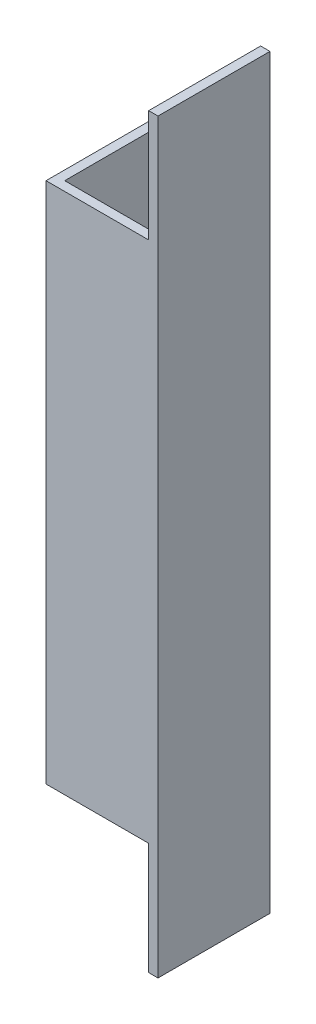
ISO-10303-21;
HEADER;
FILE_DESCRIPTION(('STEP AP214'),'2;1');
FILE_NAME('part.step','',(''),(''),'','','');
FILE_SCHEMA(('AUTOMOTIVE_DESIGN { 1 0 10303 214 1 1 1 1 }'));
ENDSEC;
DATA;
#1=APPLICATION_CONTEXT('core data for automotive mechanical design processes');
#2=APPLICATION_PROTOCOL_DEFINITION('international standard','automotive_design',2000,#1);
#3=PRODUCT_CONTEXT('',#1,'mechanical');
#4=PRODUCT('Part','Part','',(#3));
#5=PRODUCT_RELATED_PRODUCT_CATEGORY('part','',(#4));
#6=PRODUCT_DEFINITION_FORMATION('','',#4);
#7=PRODUCT_DEFINITION_CONTEXT('part definition',#1,'design');
#8=PRODUCT_DEFINITION('design','',#6,#7);
#9=PRODUCT_DEFINITION_SHAPE('','',#8);
#10=(LENGTH_UNIT() NAMED_UNIT(*) SI_UNIT(.MILLI.,.METRE.));
#11=(NAMED_UNIT(*) PLANE_ANGLE_UNIT() SI_UNIT($,.RADIAN.));
#12=(NAMED_UNIT(*) SI_UNIT($,.STERADIAN.) SOLID_ANGLE_UNIT());
#13=UNCERTAINTY_MEASURE_WITH_UNIT(LENGTH_MEASURE(1.E-05),#10,'distance_accuracy_value','');
#14=(GEOMETRIC_REPRESENTATION_CONTEXT(3) GLOBAL_UNCERTAINTY_ASSIGNED_CONTEXT((#13)) GLOBAL_UNIT_ASSIGNED_CONTEXT((#10,
#11,#12)) REPRESENTATION_CONTEXT('',''));
#15=CARTESIAN_POINT('',(0.,0.,0.));
#16=DIRECTION('',(0.,0.,1.));
#17=DIRECTION('',(1.,0.,0.));
#18=AXIS2_PLACEMENT_3D('',#15,#16,#17);
#19=CARTESIAN_POINT('',(0.,0.,0.));
#20=DIRECTION('',(0.,1.,0.));
#21=DIRECTION('',(0.,0.,1.));
#22=AXIS2_PLACEMENT_3D('',#19,#20,#21);
#23=PLANE('',#22);
#24=DIRECTION('',(0.,0.,-1.));
#25=VECTOR('',#24,1.);
#26=CARTESIAN_POINT('',(17.4625,0.,0.));
#27=LINE('',#26,#25);
#28=CARTESIAN_POINT('',(17.4625,0.,0.));
#29=VERTEX_POINT('',#28);
#30=CARTESIAN_POINT('',(17.4625,0.,-19.05));
#31=VERTEX_POINT('',#30);
#32=EDGE_CURVE('E118',#29,#31,#27,.T.);
#33=ORIENTED_EDGE('',*,*,#32,.T.);
#34=DIRECTION('',(-1.,0.,0.));
#35=VECTOR('',#34,1.);
#36=CARTESIAN_POINT('',(0.,0.,-19.05));
#37=LINE('',#36,#35);
#38=CARTESIAN_POINT('',(19.05,0.,-19.05));
#39=VERTEX_POINT('',#38);
#40=EDGE_CURVE('E103',#39,#31,#37,.T.);
#41=ORIENTED_EDGE('',*,*,#40,.F.);
#42=DIRECTION('',(0.,0.,-1.));
#43=VECTOR('',#42,1.);
#44=CARTESIAN_POINT('',(19.05,0.,0.));
#45=LINE('',#44,#43);
#46=CARTESIAN_POINT('',(19.05,0.,0.));
#47=VERTEX_POINT('',#46);
#48=EDGE_CURVE('E93',#47,#39,#45,.T.);
#49=ORIENTED_EDGE('',*,*,#48,.F.);
#50=DIRECTION('',(1.,0.,0.));
#51=VECTOR('',#50,1.);
#52=CARTESIAN_POINT('',(0.,0.,0.));
#53=LINE('',#52,#51);
#54=EDGE_CURVE('E104',#29,#47,#53,.T.);
#55=ORIENTED_EDGE('',*,*,#54,.F.);
#56=EDGE_LOOP('',(#33,#41,#49,#55));
#57=FACE_BOUND('',#56,.T.);
#58=ADVANCED_FACE('F57',(#57),#23,.F.);
#59=CARTESIAN_POINT('',(0.,127.,0.));
#60=DIRECTION('',(0.,1.,0.));
#61=DIRECTION('',(0.,0.,1.));
#62=AXIS2_PLACEMENT_3D('',#59,#60,#61);
#63=PLANE('',#62);
#64=DIRECTION('',(0.,0.,-1.));
#65=VECTOR('',#64,1.);
#66=CARTESIAN_POINT('',(17.4625,127.,0.));
#67=LINE('',#66,#65);
#68=CARTESIAN_POINT('',(17.4625,127.,0.));
#69=VERTEX_POINT('',#68);
#70=CARTESIAN_POINT('',(17.4625,127.,-19.05));
#71=VERTEX_POINT('',#70);
#72=EDGE_CURVE('E167',#69,#71,#67,.T.);
#73=ORIENTED_EDGE('',*,*,#72,.F.);
#74=DIRECTION('',(1.,0.,0.));
#75=VECTOR('',#74,1.);
#76=CARTESIAN_POINT('',(0.,127.,0.));
#77=LINE('',#76,#75);
#78=CARTESIAN_POINT('',(19.05,127.,0.));
#79=VERTEX_POINT('',#78);
#80=EDGE_CURVE('E120',#69,#79,#77,.T.);
#81=ORIENTED_EDGE('',*,*,#80,.T.);
#82=DIRECTION('',(0.,0.,-1.));
#83=VECTOR('',#82,1.);
#84=CARTESIAN_POINT('',(19.05,127.,0.));
#85=LINE('',#84,#83);
#86=CARTESIAN_POINT('',(19.05,127.,-19.05));
#87=VERTEX_POINT('',#86);
#88=EDGE_CURVE('E80',#79,#87,#85,.T.);
#89=ORIENTED_EDGE('',*,*,#88,.T.);
#90=DIRECTION('',(-1.,0.,0.));
#91=VECTOR('',#90,1.);
#92=CARTESIAN_POINT('',(0.,127.,-19.05));
#93=LINE('',#92,#91);
#94=EDGE_CURVE('E113',#87,#71,#93,.T.);
#95=ORIENTED_EDGE('',*,*,#94,.T.);
#96=EDGE_LOOP('',(#73,#81,#89,#95));
#97=FACE_BOUND('',#96,.T.);
#98=ADVANCED_FACE('F257',(#97),#63,.T.);
#99=CARTESIAN_POINT('',(0.,127.,0.));
#100=DIRECTION('',(1.,0.,0.));
#101=DIRECTION('',(0.,0.,-1.));
#102=AXIS2_PLACEMENT_3D('',#99,#100,#101);
#103=PLANE('',#102);
#104=DIRECTION('',(0.,-1.,0.));
#105=VECTOR('',#104,1.);
#106=CARTESIAN_POINT('',(0.,127.,0.));
#107=LINE('',#106,#105);
#108=CARTESIAN_POINT('',(0.,107.95,0.));
#109=VERTEX_POINT('',#108);
#110=CARTESIAN_POINT('',(0.,19.05,0.));
#111=VERTEX_POINT('',#110);
#112=EDGE_CURVE('E128',#109,#111,#107,.T.);
#113=ORIENTED_EDGE('',*,*,#112,.F.);
#114=DIRECTION('',(0.,0.,1.));
#115=VECTOR('',#114,1.);
#116=CARTESIAN_POINT('',(0.,107.95,0.));
#117=LINE('',#116,#115);
#118=CARTESIAN_POINT('',(0.,107.95,-19.05));
#119=VERTEX_POINT('',#118);
#120=EDGE_CURVE('E262',#119,#109,#117,.T.);
#121=ORIENTED_EDGE('',*,*,#120,.F.);
#122=DIRECTION('',(0.,-1.,0.));
#123=VECTOR('',#122,1.);
#124=CARTESIAN_POINT('',(0.,127.,-19.05));
#125=LINE('',#124,#123);
#126=CARTESIAN_POINT('',(0.,19.05,-19.05));
#127=VERTEX_POINT('',#126);
#128=EDGE_CURVE('E114',#119,#127,#125,.T.);
#129=ORIENTED_EDGE('',*,*,#128,.T.);
#130=DIRECTION('',(0.,0.,-1.));
#131=VECTOR('',#130,1.);
#132=CARTESIAN_POINT('',(0.,19.05,0.));
#133=LINE('',#132,#131);
#134=EDGE_CURVE('E220',#111,#127,#133,.T.);
#135=ORIENTED_EDGE('',*,*,#134,.F.);
#136=EDGE_LOOP('',(#113,#121,#129,#135));
#137=FACE_BOUND('',#136,.T.);
#138=ADVANCED_FACE('F59',(#137),#103,.F.);
#139=CARTESIAN_POINT('',(0.,127.,0.));
#140=DIRECTION('',(0.,0.,-1.));
#141=DIRECTION('',(-1.,0.,0.));
#142=AXIS2_PLACEMENT_3D('',#139,#140,#141);
#143=PLANE('',#142);
#144=DIRECTION('',(0.,1.,0.));
#145=VECTOR('',#144,1.);
#146=CARTESIAN_POINT('',(17.4625,127.,0.));
#147=LINE('',#146,#145);
#148=CARTESIAN_POINT('',(17.4625,107.95,0.));
#149=VERTEX_POINT('',#148);
#150=EDGE_CURVE('E258',#149,#69,#147,.T.);
#151=ORIENTED_EDGE('',*,*,#150,.F.);
#152=DIRECTION('',(-1.,0.,0.));
#153=VECTOR('',#152,1.);
#154=CARTESIAN_POINT('',(17.4625,107.95,0.));
#155=LINE('',#154,#153);
#156=EDGE_CURVE('E218',#149,#109,#155,.T.);
#157=ORIENTED_EDGE('',*,*,#156,.T.);
#158=ORIENTED_EDGE('',*,*,#112,.T.);
#159=DIRECTION('',(-1.,0.,0.));
#160=VECTOR('',#159,1.);
#161=CARTESIAN_POINT('',(17.4625,19.05,0.));
#162=LINE('',#161,#160);
#163=CARTESIAN_POINT('',(17.4625,19.05,0.));
#164=VERTEX_POINT('',#163);
#165=EDGE_CURVE('E163',#164,#111,#162,.T.);
#166=ORIENTED_EDGE('',*,*,#165,.F.);
#167=DIRECTION('',(0.,1.,0.));
#168=VECTOR('',#167,1.);
#169=CARTESIAN_POINT('',(17.4625,0.,0.));
#170=LINE('',#169,#168);
#171=EDGE_CURVE('E187',#29,#164,#170,.T.);
#172=ORIENTED_EDGE('',*,*,#171,.F.);
#173=ORIENTED_EDGE('',*,*,#54,.T.);
#174=DIRECTION('',(0.,-1.,0.));
#175=VECTOR('',#174,1.);
#176=CARTESIAN_POINT('',(19.05,127.,0.));
#177=LINE('',#176,#175);
#178=EDGE_CURVE('E99',#79,#47,#177,.T.);
#179=ORIENTED_EDGE('',*,*,#178,.F.);
#180=ORIENTED_EDGE('',*,*,#80,.F.);
#181=EDGE_LOOP('',(#151,#157,#158,#166,#172,#173,#179,#180));
#182=FACE_BOUND('',#181,.T.);
#183=ADVANCED_FACE('F182',(#182),#143,.F.);
#184=CARTESIAN_POINT('',(19.05,127.,0.));
#185=DIRECTION('',(-1.,0.,0.));
#186=DIRECTION('',(0.,0.,1.));
#187=AXIS2_PLACEMENT_3D('',#184,#185,#186);
#188=PLANE('',#187);
#189=ORIENTED_EDGE('',*,*,#48,.T.);
#190=DIRECTION('',(0.,-1.,0.));
#191=VECTOR('',#190,1.);
#192=CARTESIAN_POINT('',(19.05,127.,-19.05));
#193=LINE('',#192,#191);
#194=EDGE_CURVE('E96',#87,#39,#193,.T.);
#195=ORIENTED_EDGE('',*,*,#194,.F.);
#196=ORIENTED_EDGE('',*,*,#88,.F.);
#197=ORIENTED_EDGE('',*,*,#178,.T.);
#198=EDGE_LOOP('',(#189,#195,#196,#197));
#199=FACE_BOUND('',#198,.T.);
#200=ADVANCED_FACE('F95',(#199),#188,.F.);
#201=CARTESIAN_POINT('',(0.,127.,-19.05));
#202=DIRECTION('',(0.,0.,1.));
#203=DIRECTION('',(1.,0.,0.));
#204=AXIS2_PLACEMENT_3D('',#201,#202,#203);
#205=PLANE('',#204);
#206=ORIENTED_EDGE('',*,*,#128,.F.);
#207=DIRECTION('',(-1.,0.,0.));
#208=VECTOR('',#207,1.);
#209=CARTESIAN_POINT('',(17.4625,107.95,-19.05));
#210=LINE('',#209,#208);
#211=CARTESIAN_POINT('',(17.4625,107.95,-19.05));
#212=VERTEX_POINT('',#211);
#213=EDGE_CURVE('E223',#212,#119,#210,.T.);
#214=ORIENTED_EDGE('',*,*,#213,.F.);
#215=DIRECTION('',(0.,-1.,0.));
#216=VECTOR('',#215,1.);
#217=CARTESIAN_POINT('',(17.4625,127.,-19.05));
#218=LINE('',#217,#216);
#219=EDGE_CURVE('E261',#71,#212,#218,.T.);
#220=ORIENTED_EDGE('',*,*,#219,.F.);
#221=ORIENTED_EDGE('',*,*,#94,.F.);
#222=ORIENTED_EDGE('',*,*,#194,.T.);
#223=ORIENTED_EDGE('',*,*,#40,.T.);
#224=DIRECTION('',(0.,-1.,0.));
#225=VECTOR('',#224,1.);
#226=CARTESIAN_POINT('',(17.4625,0.,-19.05));
#227=LINE('',#226,#225);
#228=CARTESIAN_POINT('',(17.4625,19.05,-19.05));
#229=VERTEX_POINT('',#228);
#230=EDGE_CURVE('E231',#229,#31,#227,.T.);
#231=ORIENTED_EDGE('',*,*,#230,.F.);
#232=DIRECTION('',(-1.,0.,0.));
#233=VECTOR('',#232,1.);
#234=CARTESIAN_POINT('',(17.4625,19.05,-19.05));
#235=LINE('',#234,#233);
#236=EDGE_CURVE('E159',#229,#127,#235,.T.);
#237=ORIENTED_EDGE('',*,*,#236,.T.);
#238=EDGE_LOOP('',(#206,#214,#220,#221,#222,#223,#231,#237));
#239=FACE_BOUND('',#238,.T.);
#240=ADVANCED_FACE('F109',(#239),#205,.F.);
#241=CARTESIAN_POINT('',(1.5875,127.,0.));
#242=DIRECTION('',(1.,0.,0.));
#243=DIRECTION('',(0.,0.,-1.));
#244=AXIS2_PLACEMENT_3D('',#241,#242,#243);
#245=PLANE('',#244);
#246=DIRECTION('',(0.,0.,-1.));
#247=VECTOR('',#246,1.);
#248=CARTESIAN_POINT('',(1.5875,107.95,0.));
#249=LINE('',#248,#247);
#250=CARTESIAN_POINT('',(1.5875,107.95,-1.5875));
#251=VERTEX_POINT('',#250);
#252=CARTESIAN_POINT('',(1.5875,107.95,-17.4625));
#253=VERTEX_POINT('',#252);
#254=EDGE_CURVE('E214',#251,#253,#249,.T.);
#255=ORIENTED_EDGE('',*,*,#254,.F.);
#256=DIRECTION('',(0.,-1.,0.));
#257=VECTOR('',#256,1.);
#258=CARTESIAN_POINT('',(1.5875,127.,-1.5875));
#259=LINE('',#258,#257);
#260=CARTESIAN_POINT('',(1.5875,19.05,-1.5875));
#261=VERTEX_POINT('',#260);
#262=EDGE_CURVE('E157',#251,#261,#259,.T.);
#263=ORIENTED_EDGE('',*,*,#262,.T.);
#264=DIRECTION('',(0.,0.,1.));
#265=VECTOR('',#264,1.);
#266=CARTESIAN_POINT('',(1.5875,19.05,0.));
#267=LINE('',#266,#265);
#268=CARTESIAN_POINT('',(1.5875,19.05,-17.4625));
#269=VERTEX_POINT('',#268);
#270=EDGE_CURVE('E139',#269,#261,#267,.T.);
#271=ORIENTED_EDGE('',*,*,#270,.F.);
#272=DIRECTION('',(0.,-1.,0.));
#273=VECTOR('',#272,1.);
#274=CARTESIAN_POINT('',(1.5875,127.,-17.4625));
#275=LINE('',#274,#273);
#276=EDGE_CURVE('E155',#253,#269,#275,.T.);
#277=ORIENTED_EDGE('',*,*,#276,.F.);
#278=EDGE_LOOP('',(#255,#263,#271,#277));
#279=FACE_BOUND('',#278,.T.);
#280=ADVANCED_FACE('F153',(#279),#245,.T.);
#281=CARTESIAN_POINT('',(0.,127.,-1.5875));
#282=DIRECTION('',(0.,0.,-1.));
#283=DIRECTION('',(-1.,0.,0.));
#284=AXIS2_PLACEMENT_3D('',#281,#282,#283);
#285=PLANE('',#284);
#286=DIRECTION('',(-1.,0.,0.));
#287=VECTOR('',#286,1.);
#288=CARTESIAN_POINT('',(0.,107.95,-1.5875));
#289=LINE('',#288,#287);
#290=CARTESIAN_POINT('',(17.4625,107.95,-1.5875));
#291=VERTEX_POINT('',#290);
#292=EDGE_CURVE('E217',#291,#251,#289,.T.);
#293=ORIENTED_EDGE('',*,*,#292,.F.);
#294=DIRECTION('',(0.,-1.,0.));
#295=VECTOR('',#294,1.);
#296=CARTESIAN_POINT('',(17.4625,127.,-1.5875));
#297=LINE('',#296,#295);
#298=CARTESIAN_POINT('',(17.4625,19.05,-1.5875));
#299=VERTEX_POINT('',#298);
#300=EDGE_CURVE('E174',#291,#299,#297,.T.);
#301=ORIENTED_EDGE('',*,*,#300,.T.);
#302=DIRECTION('',(1.,0.,0.));
#303=VECTOR('',#302,1.);
#304=CARTESIAN_POINT('',(0.,19.05,-1.5875));
#305=LINE('',#304,#303);
#306=EDGE_CURVE('E158',#261,#299,#305,.T.);
#307=ORIENTED_EDGE('',*,*,#306,.F.);
#308=ORIENTED_EDGE('',*,*,#262,.F.);
#309=EDGE_LOOP('',(#293,#301,#307,#308));
#310=FACE_BOUND('',#309,.T.);
#311=ADVANCED_FACE('F269',(#310),#285,.T.);
#312=CARTESIAN_POINT('',(17.4625,127.,0.));
#313=DIRECTION('',(-1.,0.,0.));
#314=DIRECTION('',(0.,0.,1.));
#315=AXIS2_PLACEMENT_3D('',#312,#313,#314);
#316=PLANE('',#315);
#317=ORIENTED_EDGE('',*,*,#300,.F.);
#318=DIRECTION('',(0.,0.,1.));
#319=VECTOR('',#318,1.);
#320=CARTESIAN_POINT('',(17.4625,107.95,0.));
#321=LINE('',#320,#319);
#322=EDGE_CURVE('E259',#291,#149,#321,.T.);
#323=ORIENTED_EDGE('',*,*,#322,.T.);
#324=ORIENTED_EDGE('',*,*,#150,.T.);
#325=ORIENTED_EDGE('',*,*,#72,.T.);
#326=ORIENTED_EDGE('',*,*,#219,.T.);
#327=CARTESIAN_POINT('',(17.4625,107.95,-17.4625));
#328=VERTEX_POINT('',#327);
#329=EDGE_CURVE('E72',#212,#328,#321,.T.);
#330=ORIENTED_EDGE('',*,*,#329,.T.);
#331=DIRECTION('',(0.,-1.,0.));
#332=VECTOR('',#331,1.);
#333=CARTESIAN_POINT('',(17.4625,127.,-17.4625));
#334=LINE('',#333,#332);
#335=CARTESIAN_POINT('',(17.4625,19.05,-17.4625));
#336=VERTEX_POINT('',#335);
#337=EDGE_CURVE('E172',#328,#336,#334,.T.);
#338=ORIENTED_EDGE('',*,*,#337,.T.);
#339=DIRECTION('',(0.,0.,-1.));
#340=VECTOR('',#339,1.);
#341=CARTESIAN_POINT('',(17.4625,19.05,0.));
#342=LINE('',#341,#340);
#343=EDGE_CURVE('E144',#336,#229,#342,.T.);
#344=ORIENTED_EDGE('',*,*,#343,.T.);
#345=ORIENTED_EDGE('',*,*,#230,.T.);
#346=ORIENTED_EDGE('',*,*,#32,.F.);
#347=ORIENTED_EDGE('',*,*,#171,.T.);
#348=EDGE_CURVE('E228',#164,#299,#342,.T.);
#349=ORIENTED_EDGE('',*,*,#348,.T.);
#350=EDGE_LOOP('',(#317,#323,#324,#325,#326,#330,#338,#344,#345,#346,#347,#349));
#351=FACE_BOUND('',#350,.T.);
#352=ADVANCED_FACE('F202',(#351),#316,.T.);
#353=CARTESIAN_POINT('',(0.,127.,-17.4625));
#354=DIRECTION('',(0.,0.,1.));
#355=DIRECTION('',(1.,0.,0.));
#356=AXIS2_PLACEMENT_3D('',#353,#354,#355);
#357=PLANE('',#356);
#358=DIRECTION('',(1.,0.,0.));
#359=VECTOR('',#358,1.);
#360=CARTESIAN_POINT('',(0.,107.95,-17.4625));
#361=LINE('',#360,#359);
#362=EDGE_CURVE('E12',#253,#328,#361,.T.);
#363=ORIENTED_EDGE('',*,*,#362,.F.);
#364=ORIENTED_EDGE('',*,*,#276,.T.);
#365=DIRECTION('',(-1.,0.,0.));
#366=VECTOR('',#365,1.);
#367=CARTESIAN_POINT('',(0.,19.05,-17.4625));
#368=LINE('',#367,#366);
#369=EDGE_CURVE('E65',#336,#269,#368,.T.);
#370=ORIENTED_EDGE('',*,*,#369,.F.);
#371=ORIENTED_EDGE('',*,*,#337,.F.);
#372=EDGE_LOOP('',(#363,#364,#370,#371));
#373=FACE_BOUND('',#372,.T.);
#374=ADVANCED_FACE('F204',(#373),#357,.T.);
#375=CARTESIAN_POINT('',(17.4625,19.05,0.));
#376=DIRECTION('',(0.,1.,0.));
#377=DIRECTION('',(0.,0.,1.));
#378=AXIS2_PLACEMENT_3D('',#375,#376,#377);
#379=PLANE('',#378);
#380=ORIENTED_EDGE('',*,*,#306,.T.);
#381=ORIENTED_EDGE('',*,*,#348,.F.);
#382=ORIENTED_EDGE('',*,*,#165,.T.);
#383=ORIENTED_EDGE('',*,*,#134,.T.);
#384=ORIENTED_EDGE('',*,*,#236,.F.);
#385=ORIENTED_EDGE('',*,*,#343,.F.);
#386=ORIENTED_EDGE('',*,*,#369,.T.);
#387=ORIENTED_EDGE('',*,*,#270,.T.);
#388=EDGE_LOOP('',(#380,#381,#382,#383,#384,#385,#386,#387));
#389=FACE_BOUND('',#388,.T.);
#390=ADVANCED_FACE('F138',(#389),#379,.F.);
#391=CARTESIAN_POINT('',(17.4625,107.95,0.));
#392=DIRECTION('',(0.,-1.,0.));
#393=DIRECTION('',(0.,0.,-1.));
#394=AXIS2_PLACEMENT_3D('',#391,#392,#393);
#395=PLANE('',#394);
#396=ORIENTED_EDGE('',*,*,#292,.T.);
#397=ORIENTED_EDGE('',*,*,#254,.T.);
#398=ORIENTED_EDGE('',*,*,#362,.T.);
#399=ORIENTED_EDGE('',*,*,#329,.F.);
#400=ORIENTED_EDGE('',*,*,#213,.T.);
#401=ORIENTED_EDGE('',*,*,#120,.T.);
#402=ORIENTED_EDGE('',*,*,#156,.F.);
#403=ORIENTED_EDGE('',*,*,#322,.F.);
#404=EDGE_LOOP('',(#396,#397,#398,#399,#400,#401,#402,#403));
#405=FACE_BOUND('',#404,.T.);
#406=ADVANCED_FACE('F210',(#405),#395,.F.);
#407=CLOSED_SHELL('',(#58,#98,#138,#183,#200,#240,#280,#311,#352,#374,#390,#406));
#408=MANIFOLD_SOLID_BREP('B2',#407);
#409=ADVANCED_BREP_SHAPE_REPRESENTATION('',(#18,#408),#14);
#410=SHAPE_DEFINITION_REPRESENTATION(#9,#409);
ENDSEC;
END-ISO-10303-21;
